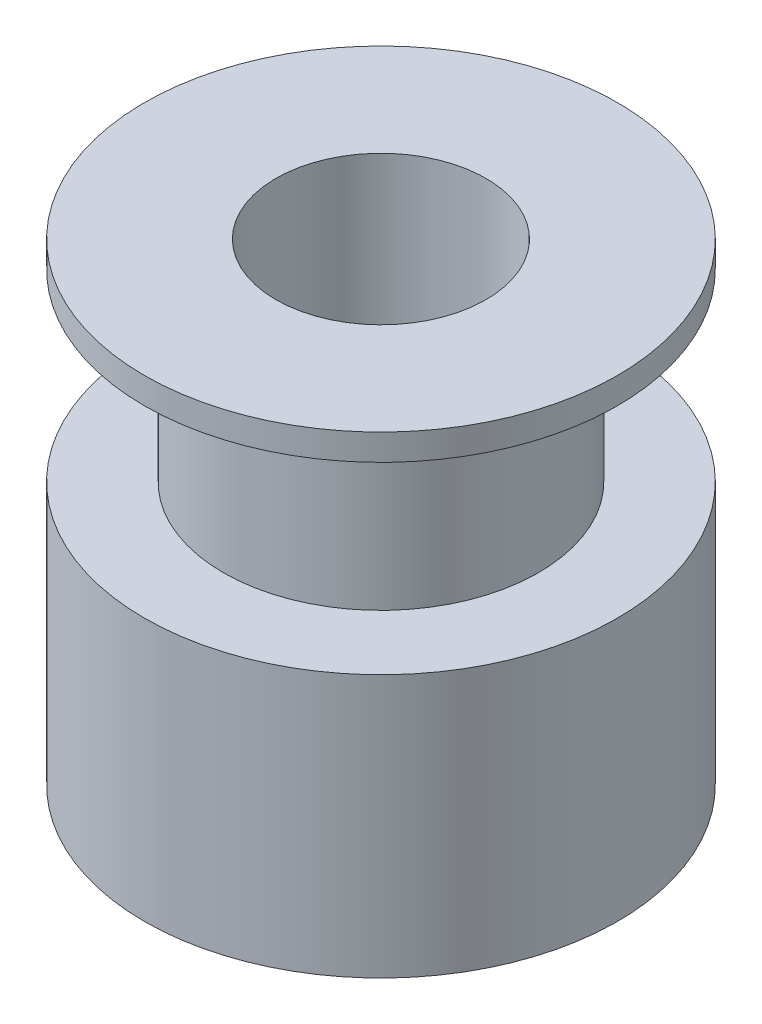
ISO-10303-21;
HEADER;
FILE_DESCRIPTION(('STEP AP214'),'2;1');
FILE_NAME('part.step','',(''),(''),'','','');
FILE_SCHEMA(('AUTOMOTIVE_DESIGN { 1 0 10303 214 1 1 1 1 }'));
ENDSEC;
DATA;
#1=APPLICATION_CONTEXT('core data for automotive mechanical design processes');
#2=APPLICATION_PROTOCOL_DEFINITION('international standard','automotive_design',2000,#1);
#3=PRODUCT_CONTEXT('',#1,'mechanical');
#4=PRODUCT('Part','Part','',(#3));
#5=PRODUCT_RELATED_PRODUCT_CATEGORY('part','',(#4));
#6=PRODUCT_DEFINITION_FORMATION('','',#4);
#7=PRODUCT_DEFINITION_CONTEXT('part definition',#1,'design');
#8=PRODUCT_DEFINITION('design','',#6,#7);
#9=PRODUCT_DEFINITION_SHAPE('','',#8);
#10=(LENGTH_UNIT() NAMED_UNIT(*) SI_UNIT(.MILLI.,.METRE.));
#11=(NAMED_UNIT(*) PLANE_ANGLE_UNIT() SI_UNIT($,.RADIAN.));
#12=(NAMED_UNIT(*) SI_UNIT($,.STERADIAN.) SOLID_ANGLE_UNIT());
#13=UNCERTAINTY_MEASURE_WITH_UNIT(LENGTH_MEASURE(1.E-05),#10,'distance_accuracy_value','');
#14=(GEOMETRIC_REPRESENTATION_CONTEXT(3) GLOBAL_UNCERTAINTY_ASSIGNED_CONTEXT((#13)) GLOBAL_UNIT_ASSIGNED_CONTEXT((#10,
#11,#12)) REPRESENTATION_CONTEXT('',''));
#15=CARTESIAN_POINT('',(0.,0.,0.));
#16=DIRECTION('',(0.,0.,1.));
#17=DIRECTION('',(1.,0.,0.));
#18=AXIS2_PLACEMENT_3D('',#15,#16,#17);
#19=CARTESIAN_POINT('',(0.,18.,0.));
#20=DIRECTION('',(0.,-1.,0.));
#21=DIRECTION('',(0.,0.,-1.));
#22=AXIS2_PLACEMENT_3D('',#19,#20,#21);
#23=CYLINDRICAL_SURFACE('',#22,9.);
#24=CARTESIAN_POINT('',(0.,0.,0.));
#25=DIRECTION('',(0.,1.,0.));
#26=DIRECTION('',(0.,0.,1.));
#27=AXIS2_PLACEMENT_3D('',#24,#25,#26);
#28=CIRCLE('',#27,9.);
#29=CARTESIAN_POINT('',(0.,0.,9.));
#30=VERTEX_POINT('',#29);
#31=EDGE_CURVE('E41',#30,#30,#28,.T.);
#32=ORIENTED_EDGE('',*,*,#31,.T.);
#33=EDGE_LOOP('',(#32));
#34=FACE_BOUND('',#33,.T.);
#35=CARTESIAN_POINT('',(0.,10.,0.));
#36=DIRECTION('',(0.,1.,0.));
#37=DIRECTION('',(0.,0.,1.));
#38=AXIS2_PLACEMENT_3D('',#35,#36,#37);
#39=CIRCLE('',#38,9.);
#40=CARTESIAN_POINT('',(0.,10.,9.));
#41=VERTEX_POINT('',#40);
#42=EDGE_CURVE('E37',#41,#41,#39,.T.);
#43=ORIENTED_EDGE('',*,*,#42,.F.);
#44=EDGE_LOOP('',(#43));
#45=FACE_BOUND('',#44,.T.);
#46=ADVANCED_FACE('F33',(#34,#45),#23,.T.);
#47=CARTESIAN_POINT('',(0.,17.,0.));
#48=DIRECTION('',(0.,1.,0.));
#49=DIRECTION('',(0.,0.,1.));
#50=AXIS2_PLACEMENT_3D('',#47,#48,#49);
#51=CIRCLE('',#50,9.);
#52=CARTESIAN_POINT('',(0.,17.,9.));
#53=VERTEX_POINT('',#52);
#54=EDGE_CURVE('E51',#53,#53,#51,.T.);
#55=ORIENTED_EDGE('',*,*,#54,.T.);
#56=EDGE_LOOP('',(#55));
#57=FACE_BOUND('',#56,.T.);
#58=CARTESIAN_POINT('',(0.,18.,0.));
#59=DIRECTION('',(0.,1.,0.));
#60=DIRECTION('',(0.,0.,1.));
#61=AXIS2_PLACEMENT_3D('',#58,#59,#60);
#62=CIRCLE('',#61,9.);
#63=CARTESIAN_POINT('',(0.,18.,9.));
#64=VERTEX_POINT('',#63);
#65=EDGE_CURVE('E10',#64,#64,#62,.T.);
#66=ORIENTED_EDGE('',*,*,#65,.F.);
#67=EDGE_LOOP('',(#66));
#68=FACE_BOUND('',#67,.T.);
#69=ADVANCED_FACE('F35',(#57,#68),#23,.T.);
#70=CARTESIAN_POINT('',(0.,18.,0.));
#71=DIRECTION('',(0.,1.,0.));
#72=DIRECTION('',(0.,0.,1.));
#73=AXIS2_PLACEMENT_3D('',#70,#71,#72);
#74=PLANE('',#73);
#75=CARTESIAN_POINT('',(0.,18.,0.));
#76=DIRECTION('',(0.,1.,0.));
#77=DIRECTION('',(0.,0.,1.));
#78=AXIS2_PLACEMENT_3D('',#75,#76,#77);
#79=CIRCLE('',#78,4.);
#80=CARTESIAN_POINT('',(0.,18.,4.));
#81=VERTEX_POINT('',#80);
#82=EDGE_CURVE('E49',#81,#81,#79,.T.);
#83=ORIENTED_EDGE('',*,*,#82,.F.);
#84=EDGE_LOOP('',(#83));
#85=FACE_BOUND('',#84,.T.);
#86=ORIENTED_EDGE('',*,*,#65,.T.);
#87=EDGE_LOOP('',(#86));
#88=FACE_BOUND('',#87,.T.);
#89=ADVANCED_FACE('F72',(#85,#88),#74,.T.);
#90=CARTESIAN_POINT('',(0.,0.,0.));
#91=DIRECTION('',(0.,1.,0.));
#92=DIRECTION('',(0.,0.,1.));
#93=AXIS2_PLACEMENT_3D('',#90,#91,#92);
#94=PLANE('',#93);
#95=CARTESIAN_POINT('',(0.,0.,0.));
#96=DIRECTION('',(0.,1.,0.));
#97=DIRECTION('',(0.,0.,1.));
#98=AXIS2_PLACEMENT_3D('',#95,#96,#97);
#99=CIRCLE('',#98,4.);
#100=CARTESIAN_POINT('',(0.,0.,4.));
#101=VERTEX_POINT('',#100);
#102=EDGE_CURVE('E46',#101,#101,#99,.T.);
#103=ORIENTED_EDGE('',*,*,#102,.T.);
#104=EDGE_LOOP('',(#103));
#105=FACE_BOUND('',#104,.T.);
#106=ORIENTED_EDGE('',*,*,#31,.F.);
#107=EDGE_LOOP('',(#106));
#108=FACE_BOUND('',#107,.T.);
#109=ADVANCED_FACE('F74',(#105,#108),#94,.F.);
#110=CARTESIAN_POINT('',(0.,0.,0.));
#111=DIRECTION('',(0.,1.,0.));
#112=DIRECTION('',(0.,0.,1.));
#113=AXIS2_PLACEMENT_3D('',#110,#111,#112);
#114=CYLINDRICAL_SURFACE('',#113,4.);
#115=ORIENTED_EDGE('',*,*,#102,.F.);
#116=EDGE_LOOP('',(#115));
#117=FACE_BOUND('',#116,.T.);
#118=ORIENTED_EDGE('',*,*,#82,.T.);
#119=EDGE_LOOP('',(#118));
#120=FACE_BOUND('',#119,.T.);
#121=ADVANCED_FACE('F70',(#117,#120),#114,.F.);
#122=CARTESIAN_POINT('',(0.,10.,0.));
#123=DIRECTION('',(0.,1.,0.));
#124=DIRECTION('',(0.,0.,1.));
#125=AXIS2_PLACEMENT_3D('',#122,#123,#124);
#126=PLANE('',#125);
#127=CARTESIAN_POINT('',(0.,10.,0.));
#128=DIRECTION('',(0.,1.,0.));
#129=DIRECTION('',(0.,0.,1.));
#130=AXIS2_PLACEMENT_3D('',#127,#128,#129);
#131=CIRCLE('',#130,6.);
#132=CARTESIAN_POINT('',(0.,10.,6.));
#133=VERTEX_POINT('',#132);
#134=EDGE_CURVE('E53',#133,#133,#131,.T.);
#135=ORIENTED_EDGE('',*,*,#134,.F.);
#136=EDGE_LOOP('',(#135));
#137=FACE_BOUND('',#136,.T.);
#138=ORIENTED_EDGE('',*,*,#42,.T.);
#139=EDGE_LOOP('',(#138));
#140=FACE_BOUND('',#139,.T.);
#141=ADVANCED_FACE('F89',(#137,#140),#126,.T.);
#142=CARTESIAN_POINT('',(0.,17.,0.));
#143=DIRECTION('',(0.,1.,0.));
#144=DIRECTION('',(0.,0.,1.));
#145=AXIS2_PLACEMENT_3D('',#142,#143,#144);
#146=PLANE('',#145);
#147=CARTESIAN_POINT('',(0.,17.,0.));
#148=DIRECTION('',(0.,1.,0.));
#149=DIRECTION('',(0.,0.,1.));
#150=AXIS2_PLACEMENT_3D('',#147,#148,#149);
#151=CIRCLE('',#150,6.);
#152=CARTESIAN_POINT('',(0.,17.,6.));
#153=VERTEX_POINT('',#152);
#154=EDGE_CURVE('E58',#153,#153,#151,.T.);
#155=ORIENTED_EDGE('',*,*,#154,.T.);
#156=EDGE_LOOP('',(#155));
#157=FACE_BOUND('',#156,.T.);
#158=ORIENTED_EDGE('',*,*,#54,.F.);
#159=EDGE_LOOP('',(#158));
#160=FACE_BOUND('',#159,.T.);
#161=ADVANCED_FACE('F91',(#157,#160),#146,.F.);
#162=CARTESIAN_POINT('',(0.,10.,0.));
#163=DIRECTION('',(0.,1.,0.));
#164=DIRECTION('',(0.,0.,1.));
#165=AXIS2_PLACEMENT_3D('',#162,#163,#164);
#166=CYLINDRICAL_SURFACE('',#165,6.);
#167=ORIENTED_EDGE('',*,*,#134,.T.);
#168=EDGE_LOOP('',(#167));
#169=FACE_BOUND('',#168,.T.);
#170=ORIENTED_EDGE('',*,*,#154,.F.);
#171=EDGE_LOOP('',(#170));
#172=FACE_BOUND('',#171,.T.);
#173=ADVANCED_FACE('F98',(#169,#172),#166,.T.);
#174=CLOSED_SHELL('',(#46,#69,#89,#109,#121,#141,#161,#173));
#175=MANIFOLD_SOLID_BREP('B2',#174);
#176=ADVANCED_BREP_SHAPE_REPRESENTATION('',(#18,#175),#14);
#177=SHAPE_DEFINITION_REPRESENTATION(#9,#176);
ENDSEC;
END-ISO-10303-21;
